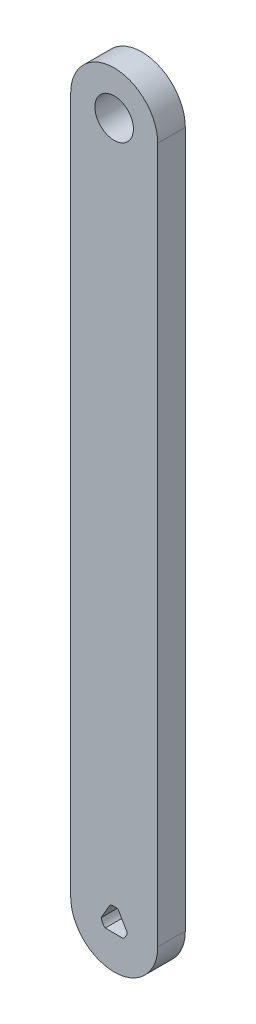
ISO-10303-21;
HEADER;
FILE_DESCRIPTION(('STEP AP214'),'2;1');
FILE_NAME('part.step','',(''),(''),'','','');
FILE_SCHEMA(('AUTOMOTIVE_DESIGN { 1 0 10303 214 1 1 1 1 }'));
ENDSEC;
DATA;
#1=APPLICATION_CONTEXT('core data for automotive mechanical design processes');
#2=APPLICATION_PROTOCOL_DEFINITION('international standard','automotive_design',2000,#1);
#3=PRODUCT_CONTEXT('',#1,'mechanical');
#4=PRODUCT('Part','Part','',(#3));
#5=PRODUCT_RELATED_PRODUCT_CATEGORY('part','',(#4));
#6=PRODUCT_DEFINITION_FORMATION('','',#4);
#7=PRODUCT_DEFINITION_CONTEXT('part definition',#1,'design');
#8=PRODUCT_DEFINITION('design','',#6,#7);
#9=PRODUCT_DEFINITION_SHAPE('','',#8);
#10=(LENGTH_UNIT() NAMED_UNIT(*) SI_UNIT(.MILLI.,.METRE.));
#11=(NAMED_UNIT(*) PLANE_ANGLE_UNIT() SI_UNIT($,.RADIAN.));
#12=(NAMED_UNIT(*) SI_UNIT($,.STERADIAN.) SOLID_ANGLE_UNIT());
#13=UNCERTAINTY_MEASURE_WITH_UNIT(LENGTH_MEASURE(1.E-05),#10,'distance_accuracy_value','');
#14=(GEOMETRIC_REPRESENTATION_CONTEXT(3) GLOBAL_UNCERTAINTY_ASSIGNED_CONTEXT((#13)) GLOBAL_UNIT_ASSIGNED_CONTEXT((#10,
#11,#12)) REPRESENTATION_CONTEXT('',''));
#15=CARTESIAN_POINT('',(0.,0.,0.));
#16=DIRECTION('',(0.,0.,1.));
#17=DIRECTION('',(1.,0.,0.));
#18=AXIS2_PLACEMENT_3D('',#15,#16,#17);
#19=CARTESIAN_POINT('',(0.,0.,4.7625));
#20=DIRECTION('',(0.,0.,1.));
#21=DIRECTION('',(1.,0.,0.));
#22=AXIS2_PLACEMENT_3D('',#19,#20,#21);
#23=PLANE('',#22);
#24=DIRECTION('',(-0.5,0.866025403784439,0.));
#25=VECTOR('',#24,1.);
#26=CARTESIAN_POINT('',(2.24683985567503,-0.491640786499874,4.7625));
#27=LINE('',#26,#25);
#28=CARTESIAN_POINT('',(2.24683985567503,-0.491640786499874,4.7625));
#29=VERTEX_POINT('',#28);
#30=CARTESIAN_POINT('',(0.697646517192062,2.19164078649987,4.7625));
#31=VERTEX_POINT('',#30);
#32=EDGE_CURVE('E122',#29,#31,#27,.T.);
#33=ORIENTED_EDGE('',*,*,#32,.F.);
#34=CARTESIAN_POINT('',(0.,0.,4.7625));
#35=DIRECTION('',(0.,0.,1.));
#36=DIRECTION('',(1.,0.,0.));
#37=AXIS2_PLACEMENT_3D('',#34,#35,#36);
#38=CIRCLE('',#37,2.3);
#39=CARTESIAN_POINT('',(1.54919333848297,-1.7,4.7625));
#40=VERTEX_POINT('',#39);
#41=EDGE_CURVE('E114',#40,#29,#38,.T.);
#42=ORIENTED_EDGE('',*,*,#41,.F.);
#43=DIRECTION('',(1.,0.,0.));
#44=VECTOR('',#43,1.);
#45=CARTESIAN_POINT('',(1.54919333848297,-1.7,4.7625));
#46=LINE('',#45,#44);
#47=CARTESIAN_POINT('',(-1.54919333848297,-1.7,4.7625));
#48=VERTEX_POINT('',#47);
#49=EDGE_CURVE('E145',#48,#40,#46,.T.);
#50=ORIENTED_EDGE('',*,*,#49,.F.);
#51=CARTESIAN_POINT('',(0.,0.,4.7625));
#52=DIRECTION('',(0.,0.,1.));
#53=DIRECTION('',(-1.,0.,0.));
#54=AXIS2_PLACEMENT_3D('',#51,#52,#53);
#55=CIRCLE('',#54,2.3);
#56=CARTESIAN_POINT('',(-2.24683985567503,-0.491640786499875,4.7625));
#57=VERTEX_POINT('',#56);
#58=EDGE_CURVE('E143',#57,#48,#55,.T.);
#59=ORIENTED_EDGE('',*,*,#58,.F.);
#60=DIRECTION('',(-0.5,-0.866025403784439,0.));
#61=VECTOR('',#60,1.);
#62=CARTESIAN_POINT('',(-0.697646517192062,2.19164078649987,4.7625));
#63=LINE('',#62,#61);
#64=CARTESIAN_POINT('',(-0.697646517192062,2.19164078649987,4.7625));
#65=VERTEX_POINT('',#64);
#66=EDGE_CURVE('E138',#65,#57,#63,.T.);
#67=ORIENTED_EDGE('',*,*,#66,.F.);
#68=CARTESIAN_POINT('',(0.,0.,4.7625));
#69=DIRECTION('',(0.,0.,1.));
#70=DIRECTION('',(1.,0.,0.));
#71=AXIS2_PLACEMENT_3D('',#68,#69,#70);
#72=CIRCLE('',#71,2.3);
#73=EDGE_CURVE('E136',#31,#65,#72,.T.);
#74=ORIENTED_EDGE('',*,*,#73,.F.);
#75=EDGE_LOOP('',(#33,#42,#50,#59,#67,#74));
#76=FACE_BOUND('',#75,.T.);
#77=CARTESIAN_POINT('',(0.,0.,4.7625));
#78=DIRECTION('',(0.,0.,1.));
#79=DIRECTION('',(1.,0.,0.));
#80=AXIS2_PLACEMENT_3D('',#77,#78,#79);
#81=CIRCLE('',#80,7.5);
#82=CARTESIAN_POINT('',(-7.5,0.,4.7625));
#83=VERTEX_POINT('',#82);
#84=CARTESIAN_POINT('',(7.5,0.,4.7625));
#85=VERTEX_POINT('',#84);
#86=EDGE_CURVE('E168',#83,#85,#81,.T.);
#87=ORIENTED_EDGE('',*,*,#86,.T.);
#88=DIRECTION('',(0.,1.,0.));
#89=VECTOR('',#88,1.);
#90=CARTESIAN_POINT('',(7.5,0.,4.7625));
#91=LINE('',#90,#89);
#92=CARTESIAN_POINT('',(7.5,120.,4.7625));
#93=VERTEX_POINT('',#92);
#94=EDGE_CURVE('E171',#85,#93,#91,.T.);
#95=ORIENTED_EDGE('',*,*,#94,.T.);
#96=CARTESIAN_POINT('',(0.,120.,4.7625));
#97=DIRECTION('',(0.,0.,1.));
#98=DIRECTION('',(1.,0.,0.));
#99=AXIS2_PLACEMENT_3D('',#96,#97,#98);
#100=CIRCLE('',#99,7.5);
#101=CARTESIAN_POINT('',(-7.5,120.,4.7625));
#102=VERTEX_POINT('',#101);
#103=EDGE_CURVE('E174',#93,#102,#100,.T.);
#104=ORIENTED_EDGE('',*,*,#103,.T.);
#105=DIRECTION('',(0.,-1.,0.));
#106=VECTOR('',#105,1.);
#107=CARTESIAN_POINT('',(-7.5,0.,4.7625));
#108=LINE('',#107,#106);
#109=EDGE_CURVE('E176',#102,#83,#108,.T.);
#110=ORIENTED_EDGE('',*,*,#109,.T.);
#111=EDGE_LOOP('',(#87,#95,#104,#110));
#112=FACE_BOUND('',#111,.T.);
#113=CARTESIAN_POINT('',(0.,120.,4.7625));
#114=DIRECTION('',(0.,0.,1.));
#115=DIRECTION('',(1.,0.,0.));
#116=AXIS2_PLACEMENT_3D('',#113,#114,#115);
#117=CIRCLE('',#116,3.325);
#118=CARTESIAN_POINT('',(-3.325,120.,4.7625));
#119=VERTEX_POINT('',#118);
#120=EDGE_CURVE('E148',#119,#119,#117,.T.);
#121=ORIENTED_EDGE('',*,*,#120,.F.);
#122=EDGE_LOOP('',(#121));
#123=FACE_BOUND('',#122,.T.);
#124=ADVANCED_FACE('F37',(#76,#112,#123),#23,.T.);
#125=CARTESIAN_POINT('',(0.,0.,0.));
#126=DIRECTION('',(0.,0.,1.));
#127=DIRECTION('',(1.,0.,0.));
#128=AXIS2_PLACEMENT_3D('',#125,#126,#127);
#129=PLANE('',#128);
#130=CARTESIAN_POINT('',(0.,0.,0.));
#131=DIRECTION('',(0.,0.,1.));
#132=DIRECTION('',(1.,0.,0.));
#133=AXIS2_PLACEMENT_3D('',#130,#131,#132);
#134=CIRCLE('',#133,7.5);
#135=CARTESIAN_POINT('',(-7.5,0.,0.));
#136=VERTEX_POINT('',#135);
#137=CARTESIAN_POINT('',(7.5,0.,0.));
#138=VERTEX_POINT('',#137);
#139=EDGE_CURVE('E130',#136,#138,#134,.T.);
#140=ORIENTED_EDGE('',*,*,#139,.F.);
#141=DIRECTION('',(0.,-1.,0.));
#142=VECTOR('',#141,1.);
#143=CARTESIAN_POINT('',(-7.5,0.,0.));
#144=LINE('',#143,#142);
#145=CARTESIAN_POINT('',(-7.5,120.,0.));
#146=VERTEX_POINT('',#145);
#147=EDGE_CURVE('E172',#146,#136,#144,.T.);
#148=ORIENTED_EDGE('',*,*,#147,.F.);
#149=CARTESIAN_POINT('',(0.,120.,0.));
#150=DIRECTION('',(0.,0.,1.));
#151=DIRECTION('',(1.,0.,0.));
#152=AXIS2_PLACEMENT_3D('',#149,#150,#151);
#153=CIRCLE('',#152,7.5);
#154=CARTESIAN_POINT('',(7.5,120.,0.));
#155=VERTEX_POINT('',#154);
#156=EDGE_CURVE('E183',#155,#146,#153,.T.);
#157=ORIENTED_EDGE('',*,*,#156,.F.);
#158=DIRECTION('',(0.,1.,0.));
#159=VECTOR('',#158,1.);
#160=CARTESIAN_POINT('',(7.5,0.,0.));
#161=LINE('',#160,#159);
#162=EDGE_CURVE('E181',#138,#155,#161,.T.);
#163=ORIENTED_EDGE('',*,*,#162,.F.);
#164=EDGE_LOOP('',(#140,#148,#157,#163));
#165=FACE_BOUND('',#164,.T.);
#166=CARTESIAN_POINT('',(0.,0.,0.));
#167=DIRECTION('',(0.,0.,1.));
#168=DIRECTION('',(1.,0.,0.));
#169=AXIS2_PLACEMENT_3D('',#166,#167,#168);
#170=CIRCLE('',#169,2.3);
#171=CARTESIAN_POINT('',(1.54919333848297,-1.7,0.));
#172=VERTEX_POINT('',#171);
#173=CARTESIAN_POINT('',(2.24683985567503,-0.491640786499874,0.));
#174=VERTEX_POINT('',#173);
#175=EDGE_CURVE('E60',#172,#174,#170,.T.);
#176=ORIENTED_EDGE('',*,*,#175,.T.);
#177=DIRECTION('',(-0.5,0.866025403784439,0.));
#178=VECTOR('',#177,1.);
#179=CARTESIAN_POINT('',(2.24683985567503,-0.491640786499874,0.));
#180=LINE('',#179,#178);
#181=CARTESIAN_POINT('',(0.697646517192062,2.19164078649987,0.));
#182=VERTEX_POINT('',#181);
#183=EDGE_CURVE('E129',#174,#182,#180,.T.);
#184=ORIENTED_EDGE('',*,*,#183,.T.);
#185=CARTESIAN_POINT('',(0.,0.,0.));
#186=DIRECTION('',(0.,0.,1.));
#187=DIRECTION('',(1.,0.,0.));
#188=AXIS2_PLACEMENT_3D('',#185,#186,#187);
#189=CIRCLE('',#188,2.3);
#190=CARTESIAN_POINT('',(-0.697646517192062,2.19164078649987,0.));
#191=VERTEX_POINT('',#190);
#192=EDGE_CURVE('E150',#182,#191,#189,.T.);
#193=ORIENTED_EDGE('',*,*,#192,.T.);
#194=DIRECTION('',(-0.5,-0.866025403784439,0.));
#195=VECTOR('',#194,1.);
#196=CARTESIAN_POINT('',(-0.697646517192062,2.19164078649987,0.));
#197=LINE('',#196,#195);
#198=CARTESIAN_POINT('',(-2.24683985567503,-0.491640786499875,0.));
#199=VERTEX_POINT('',#198);
#200=EDGE_CURVE('E153',#191,#199,#197,.T.);
#201=ORIENTED_EDGE('',*,*,#200,.T.);
#202=CARTESIAN_POINT('',(0.,0.,0.));
#203=DIRECTION('',(0.,0.,1.));
#204=DIRECTION('',(-1.,0.,0.));
#205=AXIS2_PLACEMENT_3D('',#202,#203,#204);
#206=CIRCLE('',#205,2.3);
#207=CARTESIAN_POINT('',(-1.54919333848297,-1.7,0.));
#208=VERTEX_POINT('',#207);
#209=EDGE_CURVE('E156',#199,#208,#206,.T.);
#210=ORIENTED_EDGE('',*,*,#209,.T.);
#211=DIRECTION('',(1.,0.,0.));
#212=VECTOR('',#211,1.);
#213=CARTESIAN_POINT('',(1.54919333848297,-1.7,0.));
#214=LINE('',#213,#212);
#215=EDGE_CURVE('E123',#208,#172,#214,.T.);
#216=ORIENTED_EDGE('',*,*,#215,.T.);
#217=EDGE_LOOP('',(#176,#184,#193,#201,#210,#216));
#218=FACE_BOUND('',#217,.T.);
#219=CARTESIAN_POINT('',(0.,120.,0.));
#220=DIRECTION('',(0.,0.,1.));
#221=DIRECTION('',(1.,0.,0.));
#222=AXIS2_PLACEMENT_3D('',#219,#220,#221);
#223=CIRCLE('',#222,3.325);
#224=CARTESIAN_POINT('',(-3.325,120.,0.));
#225=VERTEX_POINT('',#224);
#226=EDGE_CURVE('E262',#225,#225,#223,.T.);
#227=ORIENTED_EDGE('',*,*,#226,.T.);
#228=EDGE_LOOP('',(#227));
#229=FACE_BOUND('',#228,.T.);
#230=ADVANCED_FACE('F201',(#165,#218,#229),#129,.F.);
#231=CARTESIAN_POINT('',(0.,0.,4.7625));
#232=DIRECTION('',(0.,0.,-1.));
#233=DIRECTION('',(-1.,0.,0.));
#234=AXIS2_PLACEMENT_3D('',#231,#232,#233);
#235=CYLINDRICAL_SURFACE('',#234,7.5);
#236=ORIENTED_EDGE('',*,*,#139,.T.);
#237=DIRECTION('',(0.,0.,-1.));
#238=VECTOR('',#237,1.);
#239=CARTESIAN_POINT('',(7.5,0.,4.7625));
#240=LINE('',#239,#238);
#241=EDGE_CURVE('E11',#85,#138,#240,.T.);
#242=ORIENTED_EDGE('',*,*,#241,.F.);
#243=ORIENTED_EDGE('',*,*,#86,.F.);
#244=DIRECTION('',(0.,0.,-1.));
#245=VECTOR('',#244,1.);
#246=CARTESIAN_POINT('',(-7.5,0.,4.7625));
#247=LINE('',#246,#245);
#248=EDGE_CURVE('E178',#83,#136,#247,.T.);
#249=ORIENTED_EDGE('',*,*,#248,.T.);
#250=EDGE_LOOP('',(#236,#242,#243,#249));
#251=FACE_BOUND('',#250,.T.);
#252=ADVANCED_FACE('F39',(#251),#235,.T.);
#253=CARTESIAN_POINT('',(7.5,0.,4.7625));
#254=DIRECTION('',(-1.,0.,0.));
#255=DIRECTION('',(0.,0.,1.));
#256=AXIS2_PLACEMENT_3D('',#253,#254,#255);
#257=PLANE('',#256);
#258=ORIENTED_EDGE('',*,*,#162,.T.);
#259=DIRECTION('',(0.,0.,-1.));
#260=VECTOR('',#259,1.);
#261=CARTESIAN_POINT('',(7.5,120.,4.7625));
#262=LINE('',#261,#260);
#263=EDGE_CURVE('E45',#93,#155,#262,.T.);
#264=ORIENTED_EDGE('',*,*,#263,.F.);
#265=ORIENTED_EDGE('',*,*,#94,.F.);
#266=ORIENTED_EDGE('',*,*,#241,.T.);
#267=EDGE_LOOP('',(#258,#264,#265,#266));
#268=FACE_BOUND('',#267,.T.);
#269=ADVANCED_FACE('F211',(#268),#257,.F.);
#270=CARTESIAN_POINT('',(0.,120.,4.7625));
#271=DIRECTION('',(0.,0.,-1.));
#272=DIRECTION('',(-1.,0.,0.));
#273=AXIS2_PLACEMENT_3D('',#270,#271,#272);
#274=CYLINDRICAL_SURFACE('',#273,7.5);
#275=ORIENTED_EDGE('',*,*,#156,.T.);
#276=DIRECTION('',(0.,0.,-1.));
#277=VECTOR('',#276,1.);
#278=CARTESIAN_POINT('',(-7.5,120.,4.7625));
#279=LINE('',#278,#277);
#280=EDGE_CURVE('E188',#102,#146,#279,.T.);
#281=ORIENTED_EDGE('',*,*,#280,.F.);
#282=ORIENTED_EDGE('',*,*,#103,.F.);
#283=ORIENTED_EDGE('',*,*,#263,.T.);
#284=EDGE_LOOP('',(#275,#281,#282,#283));
#285=FACE_BOUND('',#284,.T.);
#286=ADVANCED_FACE('F195',(#285),#274,.T.);
#287=CARTESIAN_POINT('',(-7.5,0.,4.7625));
#288=DIRECTION('',(1.,0.,0.));
#289=DIRECTION('',(0.,0.,-1.));
#290=AXIS2_PLACEMENT_3D('',#287,#288,#289);
#291=PLANE('',#290);
#292=ORIENTED_EDGE('',*,*,#147,.T.);
#293=ORIENTED_EDGE('',*,*,#248,.F.);
#294=ORIENTED_EDGE('',*,*,#109,.F.);
#295=ORIENTED_EDGE('',*,*,#280,.T.);
#296=EDGE_LOOP('',(#292,#293,#294,#295));
#297=FACE_BOUND('',#296,.T.);
#298=ADVANCED_FACE('F205',(#297),#291,.F.);
#299=CARTESIAN_POINT('',(0.,0.,4.7625));
#300=DIRECTION('',(0.,0.,-1.));
#301=DIRECTION('',(-1.,0.,0.));
#302=AXIS2_PLACEMENT_3D('',#299,#300,#301);
#303=CYLINDRICAL_SURFACE('',#302,2.3);
#304=ORIENTED_EDGE('',*,*,#175,.F.);
#305=DIRECTION('',(0.,0.,-1.));
#306=VECTOR('',#305,1.);
#307=CARTESIAN_POINT('',(1.54919333848297,-1.7,4.7625));
#308=LINE('',#307,#306);
#309=EDGE_CURVE('E118',#40,#172,#308,.T.);
#310=ORIENTED_EDGE('',*,*,#309,.F.);
#311=ORIENTED_EDGE('',*,*,#41,.T.);
#312=DIRECTION('',(0.,0.,-1.));
#313=VECTOR('',#312,1.);
#314=CARTESIAN_POINT('',(2.24683985567503,-0.491640786499874,4.7625));
#315=LINE('',#314,#313);
#316=EDGE_CURVE('E117',#29,#174,#315,.T.);
#317=ORIENTED_EDGE('',*,*,#316,.T.);
#318=EDGE_LOOP('',(#304,#310,#311,#317));
#319=FACE_BOUND('',#318,.T.);
#320=ADVANCED_FACE('F116',(#319),#303,.F.);
#321=CARTESIAN_POINT('',(2.24683985567503,-0.491640786499874,4.7625));
#322=DIRECTION('',(-0.866025403784439,-0.5,0.));
#323=DIRECTION('',(0.5,-0.866025403784439,0.));
#324=AXIS2_PLACEMENT_3D('',#321,#322,#323);
#325=PLANE('',#324);
#326=ORIENTED_EDGE('',*,*,#183,.F.);
#327=ORIENTED_EDGE('',*,*,#316,.F.);
#328=ORIENTED_EDGE('',*,*,#32,.T.);
#329=DIRECTION('',(0.,0.,-1.));
#330=VECTOR('',#329,1.);
#331=CARTESIAN_POINT('',(0.697646517192062,2.19164078649987,4.7625));
#332=LINE('',#331,#330);
#333=EDGE_CURVE('E131',#31,#182,#332,.T.);
#334=ORIENTED_EDGE('',*,*,#333,.T.);
#335=EDGE_LOOP('',(#326,#327,#328,#334));
#336=FACE_BOUND('',#335,.T.);
#337=ADVANCED_FACE('F126',(#336),#325,.T.);
#338=CARTESIAN_POINT('',(0.,0.,4.7625));
#339=DIRECTION('',(0.,0.,-1.));
#340=DIRECTION('',(-1.,0.,0.));
#341=AXIS2_PLACEMENT_3D('',#338,#339,#340);
#342=CYLINDRICAL_SURFACE('',#341,2.3);
#343=ORIENTED_EDGE('',*,*,#192,.F.);
#344=ORIENTED_EDGE('',*,*,#333,.F.);
#345=ORIENTED_EDGE('',*,*,#73,.T.);
#346=DIRECTION('',(0.,0.,-1.));
#347=VECTOR('',#346,1.);
#348=CARTESIAN_POINT('',(-0.697646517192062,2.19164078649987,4.7625));
#349=LINE('',#348,#347);
#350=EDGE_CURVE('E165',#65,#191,#349,.T.);
#351=ORIENTED_EDGE('',*,*,#350,.T.);
#352=EDGE_LOOP('',(#343,#344,#345,#351));
#353=FACE_BOUND('',#352,.T.);
#354=ADVANCED_FACE('F234',(#353),#342,.F.);
#355=CARTESIAN_POINT('',(-0.697646517192062,2.19164078649987,4.7625));
#356=DIRECTION('',(0.866025403784439,-0.5,0.));
#357=DIRECTION('',(0.5,0.866025403784439,0.));
#358=AXIS2_PLACEMENT_3D('',#355,#356,#357);
#359=PLANE('',#358);
#360=ORIENTED_EDGE('',*,*,#200,.F.);
#361=ORIENTED_EDGE('',*,*,#350,.F.);
#362=ORIENTED_EDGE('',*,*,#66,.T.);
#363=DIRECTION('',(0.,0.,-1.));
#364=VECTOR('',#363,1.);
#365=CARTESIAN_POINT('',(-2.24683985567503,-0.491640786499875,4.7625));
#366=LINE('',#365,#364);
#367=EDGE_CURVE('E163',#57,#199,#366,.T.);
#368=ORIENTED_EDGE('',*,*,#367,.T.);
#369=EDGE_LOOP('',(#360,#361,#362,#368));
#370=FACE_BOUND('',#369,.T.);
#371=ADVANCED_FACE('F238',(#370),#359,.T.);
#372=CARTESIAN_POINT('',(0.,0.,4.7625));
#373=DIRECTION('',(0.,0.,-1.));
#374=DIRECTION('',(-1.,0.,0.));
#375=AXIS2_PLACEMENT_3D('',#372,#373,#374);
#376=CYLINDRICAL_SURFACE('',#375,2.3);
#377=ORIENTED_EDGE('',*,*,#209,.F.);
#378=ORIENTED_EDGE('',*,*,#367,.F.);
#379=ORIENTED_EDGE('',*,*,#58,.T.);
#380=DIRECTION('',(0.,0.,-1.));
#381=VECTOR('',#380,1.);
#382=CARTESIAN_POINT('',(-1.54919333848297,-1.7,4.7625));
#383=LINE('',#382,#381);
#384=EDGE_CURVE('E52',#48,#208,#383,.T.);
#385=ORIENTED_EDGE('',*,*,#384,.T.);
#386=EDGE_LOOP('',(#377,#378,#379,#385));
#387=FACE_BOUND('',#386,.T.);
#388=ADVANCED_FACE('F244',(#387),#376,.F.);
#389=CARTESIAN_POINT('',(1.54919333848297,-1.7,4.7625));
#390=DIRECTION('',(0.,1.,0.));
#391=DIRECTION('',(-1.,0.,0.));
#392=AXIS2_PLACEMENT_3D('',#389,#390,#391);
#393=PLANE('',#392);
#394=ORIENTED_EDGE('',*,*,#215,.F.);
#395=ORIENTED_EDGE('',*,*,#384,.F.);
#396=ORIENTED_EDGE('',*,*,#49,.T.);
#397=ORIENTED_EDGE('',*,*,#309,.T.);
#398=EDGE_LOOP('',(#394,#395,#396,#397));
#399=FACE_BOUND('',#398,.T.);
#400=ADVANCED_FACE('F248',(#399),#393,.T.);
#401=CARTESIAN_POINT('',(0.,120.,4.7625));
#402=DIRECTION('',(0.,0.,-1.));
#403=DIRECTION('',(-1.,0.,0.));
#404=AXIS2_PLACEMENT_3D('',#401,#402,#403);
#405=CYLINDRICAL_SURFACE('',#404,3.325);
#406=CARTESIAN_POINT('',(-3.325,120.,4.7625));
#407=CARTESIAN_POINT('',(-3.325,120.,4.712890625));
#408=CARTESIAN_POINT('',(-3.325,120.,4.66328125));
#409=CARTESIAN_POINT('',(-3.325,120.,4.5640625));
#410=CARTESIAN_POINT('',(-3.325,120.,4.514453125));
#411=CARTESIAN_POINT('',(-3.325,120.,4.415234375));
#412=CARTESIAN_POINT('',(-3.325,120.,4.365625));
#413=CARTESIAN_POINT('',(-3.325,120.,4.26640625));
#414=CARTESIAN_POINT('',(-3.325,120.,4.216796875));
#415=CARTESIAN_POINT('',(-3.325,120.,4.117578125));
#416=CARTESIAN_POINT('',(-3.325,120.,4.06796875));
#417=CARTESIAN_POINT('',(-3.325,120.,3.96875));
#418=CARTESIAN_POINT('',(-3.325,120.,3.919140625));
#419=CARTESIAN_POINT('',(-3.325,120.,3.819921875));
#420=CARTESIAN_POINT('',(-3.325,120.,3.7703125));
#421=CARTESIAN_POINT('',(-3.325,120.,3.67109375));
#422=CARTESIAN_POINT('',(-3.325,120.,3.621484375));
#423=CARTESIAN_POINT('',(-3.325,120.,3.522265625));
#424=CARTESIAN_POINT('',(-3.325,120.,3.47265625));
#425=CARTESIAN_POINT('',(-3.325,120.,3.3734375));
#426=CARTESIAN_POINT('',(-3.325,120.,3.323828125));
#427=CARTESIAN_POINT('',(-3.325,120.,3.224609375));
#428=CARTESIAN_POINT('',(-3.325,120.,3.175));
#429=CARTESIAN_POINT('',(-3.325,120.,3.07578125));
#430=CARTESIAN_POINT('',(-3.325,120.,3.026171875));
#431=CARTESIAN_POINT('',(-3.325,120.,2.926953125));
#432=CARTESIAN_POINT('',(-3.325,120.,2.87734375));
#433=CARTESIAN_POINT('',(-3.325,120.,2.778125));
#434=CARTESIAN_POINT('',(-3.325,120.,2.728515625));
#435=CARTESIAN_POINT('',(-3.325,120.,2.629296875));
#436=CARTESIAN_POINT('',(-3.325,120.,2.5796875));
#437=CARTESIAN_POINT('',(-3.325,120.,2.48046875));
#438=CARTESIAN_POINT('',(-3.325,120.,2.430859375));
#439=CARTESIAN_POINT('',(-3.325,120.,2.331640625));
#440=CARTESIAN_POINT('',(-3.325,120.,2.28203125));
#441=CARTESIAN_POINT('',(-3.325,120.,2.1828125));
#442=CARTESIAN_POINT('',(-3.325,120.,2.133203125));
#443=CARTESIAN_POINT('',(-3.325,120.,2.033984375));
#444=CARTESIAN_POINT('',(-3.325,120.,1.984375));
#445=CARTESIAN_POINT('',(-3.325,120.,1.88515625));
#446=CARTESIAN_POINT('',(-3.325,120.,1.835546875));
#447=CARTESIAN_POINT('',(-3.325,120.,1.736328125));
#448=CARTESIAN_POINT('',(-3.325,120.,1.68671875));
#449=CARTESIAN_POINT('',(-3.325,120.,1.5875));
#450=CARTESIAN_POINT('',(-3.325,120.,1.537890625));
#451=CARTESIAN_POINT('',(-3.325,120.,1.438671875));
#452=CARTESIAN_POINT('',(-3.325,120.,1.3890625));
#453=CARTESIAN_POINT('',(-3.325,120.,1.28984375));
#454=CARTESIAN_POINT('',(-3.325,120.,1.240234375));
#455=CARTESIAN_POINT('',(-3.325,120.,1.141015625));
#456=CARTESIAN_POINT('',(-3.325,120.,1.09140625));
#457=CARTESIAN_POINT('',(-3.325,120.,0.9921875));
#458=CARTESIAN_POINT('',(-3.325,120.,0.942578125));
#459=CARTESIAN_POINT('',(-3.325,120.,0.843359375));
#460=CARTESIAN_POINT('',(-3.325,120.,0.79375));
#461=CARTESIAN_POINT('',(-3.325,120.,0.69453125));
#462=CARTESIAN_POINT('',(-3.325,120.,0.644921875));
#463=CARTESIAN_POINT('',(-3.325,120.,0.545703125));
#464=CARTESIAN_POINT('',(-3.325,120.,0.49609375));
#465=CARTESIAN_POINT('',(-3.325,120.,0.396875));
#466=CARTESIAN_POINT('',(-3.325,120.,0.347265625));
#467=CARTESIAN_POINT('',(-3.325,120.,0.248046875));
#468=CARTESIAN_POINT('',(-3.325,120.,0.1984375));
#469=CARTESIAN_POINT('',(-3.325,120.,0.09921875));
#470=CARTESIAN_POINT('',(-3.325,120.,0.049609375));
#471=CARTESIAN_POINT('',(-3.325,120.,0.));
#472=B_SPLINE_CURVE_WITH_KNOTS('',3,(#406,#407,#408,#409,#410,#411,#412,#413,#414,#415,#416,
#417,#418,#419,#420,#421,#422,#423,#424,#425,#426,#427,#428,#429,#430,#431,#432,#433,#434,#435,
#436,#437,#438,#439,#440,#441,#442,#443,#444,#445,#446,#447,#448,#449,#450,#451,#452,#453,#454,
#455,#456,#457,#458,#459,#460,#461,#462,#463,#464,#465,#466,#467,#468,#469,#470,#471),
.UNSPECIFIED.,.F.,.F.,(4,2,2,2,2,2,2,2,2,2,2,2,2,2,2,2,2,2,2,2,2,2,2,2,2,2,2,2,2,2,2,2,4),(0.,
0.148828124999999,0.297656249999999,0.446484374999999,0.595312499999999,0.744140625,0.89296875,
1.041796875,1.190625,1.339453125,1.48828125,1.637109375,1.7859375,1.934765625,2.08359375,
2.232421875,2.38125,2.530078125,2.67890625,2.827734375,2.9765625,3.125390625,3.27421875,
3.423046875,3.571875,3.720703125,3.86953125,4.018359375,4.1671875,4.316015625,4.46484375,
4.613671875,4.7625),.UNSPECIFIED.);
#473=EDGE_CURVE('BSEAM252',#119,#225,#472,.T.);
#474=ORIENTED_EDGE('',*,*,#120,.T.);
#475=ORIENTED_EDGE('',*,*,#226,.F.);
#476=ORIENTED_EDGE('',*,*,#473,.T.);
#477=ORIENTED_EDGE('',*,*,#473,.F.);
#478=EDGE_LOOP('',(#474,#476,#475,#477));
#479=FACE_BOUND('',#478,.T.);
#480=ADVANCED_FACE('F252',(#479),#405,.F.);
#481=CLOSED_SHELL('',(#124,#230,#252,#269,#286,#298,#320,#337,#354,#371,#388,#400,#480));
#482=MANIFOLD_SOLID_BREP('B2',#481);
#483=ADVANCED_BREP_SHAPE_REPRESENTATION('',(#18,#482),#14);
#484=SHAPE_DEFINITION_REPRESENTATION(#9,#483);
ENDSEC;
END-ISO-10303-21;
